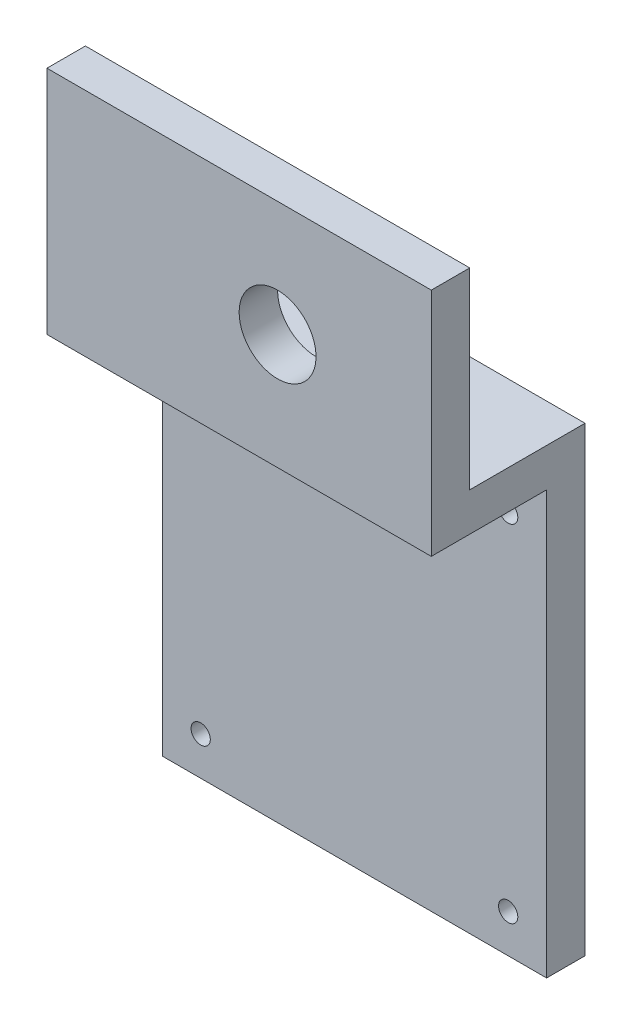
ISO-10303-21;
HEADER;
FILE_DESCRIPTION(('STEP AP214'),'2;1');
FILE_NAME('part.step','',(''),(''),'','','');
FILE_SCHEMA(('AUTOMOTIVE_DESIGN { 1 0 10303 214 1 1 1 1 }'));
ENDSEC;
DATA;
#1=APPLICATION_CONTEXT('core data for automotive mechanical design processes');
#2=APPLICATION_PROTOCOL_DEFINITION('international standard','automotive_design',2000,#1);
#3=PRODUCT_CONTEXT('',#1,'mechanical');
#4=PRODUCT('Part','Part','',(#3));
#5=PRODUCT_RELATED_PRODUCT_CATEGORY('part','',(#4));
#6=PRODUCT_DEFINITION_FORMATION('','',#4);
#7=PRODUCT_DEFINITION_CONTEXT('part definition',#1,'design');
#8=PRODUCT_DEFINITION('design','',#6,#7);
#9=PRODUCT_DEFINITION_SHAPE('','',#8);
#10=(LENGTH_UNIT() NAMED_UNIT(*) SI_UNIT(.MILLI.,.METRE.));
#11=(NAMED_UNIT(*) PLANE_ANGLE_UNIT() SI_UNIT($,.RADIAN.));
#12=(NAMED_UNIT(*) SI_UNIT($,.STERADIAN.) SOLID_ANGLE_UNIT());
#13=UNCERTAINTY_MEASURE_WITH_UNIT(LENGTH_MEASURE(1.E-05),#10,'distance_accuracy_value','');
#14=(GEOMETRIC_REPRESENTATION_CONTEXT(3) GLOBAL_UNCERTAINTY_ASSIGNED_CONTEXT((#13)) GLOBAL_UNIT_ASSIGNED_CONTEXT((#10,
#11,#12)) REPRESENTATION_CONTEXT('',''));
#15=CARTESIAN_POINT('',(0.,0.,0.));
#16=DIRECTION('',(0.,0.,1.));
#17=DIRECTION('',(1.,0.,0.));
#18=AXIS2_PLACEMENT_3D('',#15,#16,#17);
#19=CARTESIAN_POINT('',(-50.,60.,10.));
#20=DIRECTION('',(0.,-1.,0.));
#21=DIRECTION('',(0.,0.,-1.));
#22=AXIS2_PLACEMENT_3D('',#19,#20,#21);
#23=PLANE('',#22);
#24=DIRECTION('',(-1.,0.,0.));
#25=VECTOR('',#24,1.);
#26=CARTESIAN_POINT('',(-50.,60.,30.));
#27=LINE('',#26,#25);
#28=CARTESIAN_POINT('',(50.,60.,30.));
#29=VERTEX_POINT('',#28);
#30=CARTESIAN_POINT('',(-50.,60.,30.));
#31=VERTEX_POINT('',#30);
#32=EDGE_CURVE('E49',#29,#31,#27,.T.);
#33=ORIENTED_EDGE('',*,*,#32,.F.);
#34=DIRECTION('',(0.,0.,-1.));
#35=VECTOR('',#34,1.);
#36=CARTESIAN_POINT('',(50.,60.,10.));
#37=LINE('',#36,#35);
#38=CARTESIAN_POINT('',(50.,60.,0.));
#39=VERTEX_POINT('',#38);
#40=EDGE_CURVE('E11',#29,#39,#37,.T.);
#41=ORIENTED_EDGE('',*,*,#40,.T.);
#42=DIRECTION('',(-1.,0.,0.));
#43=VECTOR('',#42,1.);
#44=CARTESIAN_POINT('',(-50.,60.,0.));
#45=LINE('',#44,#43);
#46=CARTESIAN_POINT('',(-50.,60.,0.));
#47=VERTEX_POINT('',#46);
#48=EDGE_CURVE('E156',#39,#47,#45,.T.);
#49=ORIENTED_EDGE('',*,*,#48,.T.);
#50=DIRECTION('',(0.,0.,-1.));
#51=VECTOR('',#50,1.);
#52=CARTESIAN_POINT('',(-50.,60.,10.));
#53=LINE('',#52,#51);
#54=EDGE_CURVE('E43',#31,#47,#53,.T.);
#55=ORIENTED_EDGE('',*,*,#54,.F.);
#56=EDGE_LOOP('',(#33,#41,#49,#55));
#57=FACE_BOUND('',#56,.T.);
#58=ADVANCED_FACE('F34',(#57),#23,.F.);
#59=CARTESIAN_POINT('',(0.,0.,10.));
#60=DIRECTION('',(0.,0.,-1.));
#61=DIRECTION('',(-1.,0.,0.));
#62=AXIS2_PLACEMENT_3D('',#59,#60,#61);
#63=PLANE('',#62);
#64=CARTESIAN_POINT('',(40.,40.,10.));
#65=DIRECTION('',(0.,0.,-1.));
#66=DIRECTION('',(-1.,0.,0.));
#67=AXIS2_PLACEMENT_3D('',#64,#65,#66);
#68=CIRCLE('',#67,2.49999999999998);
#69=CARTESIAN_POINT('',(37.5,40.,10.));
#70=VERTEX_POINT('',#69);
#71=EDGE_CURVE('E246',#70,#70,#68,.T.);
#72=ORIENTED_EDGE('',*,*,#71,.T.);
#73=EDGE_LOOP('',(#72));
#74=FACE_BOUND('',#73,.T.);
#75=CARTESIAN_POINT('',(-40.,40.,10.));
#76=DIRECTION('',(0.,0.,-1.));
#77=DIRECTION('',(-1.,0.,0.));
#78=AXIS2_PLACEMENT_3D('',#75,#76,#77);
#79=CIRCLE('',#78,2.49999999999998);
#80=CARTESIAN_POINT('',(-42.5,40.,10.));
#81=VERTEX_POINT('',#80);
#82=EDGE_CURVE('E38',#81,#81,#79,.T.);
#83=ORIENTED_EDGE('',*,*,#82,.T.);
#84=EDGE_LOOP('',(#83));
#85=FACE_BOUND('',#84,.T.);
#86=CARTESIAN_POINT('',(-40.,-50.,10.));
#87=DIRECTION('',(0.,0.,-1.));
#88=DIRECTION('',(-1.,0.,0.));
#89=AXIS2_PLACEMENT_3D('',#86,#87,#88);
#90=CIRCLE('',#89,2.49999999999998);
#91=CARTESIAN_POINT('',(-42.5,-50.,10.));
#92=VERTEX_POINT('',#91);
#93=EDGE_CURVE('E239',#92,#92,#90,.T.);
#94=ORIENTED_EDGE('',*,*,#93,.T.);
#95=EDGE_LOOP('',(#94));
#96=FACE_BOUND('',#95,.T.);
#97=CARTESIAN_POINT('',(40.,-50.,10.));
#98=DIRECTION('',(0.,0.,-1.));
#99=DIRECTION('',(-1.,0.,0.));
#100=AXIS2_PLACEMENT_3D('',#97,#98,#99);
#101=CIRCLE('',#100,2.49999999999998);
#102=CARTESIAN_POINT('',(37.5,-50.,10.));
#103=VERTEX_POINT('',#102);
#104=EDGE_CURVE('E125',#103,#103,#101,.T.);
#105=ORIENTED_EDGE('',*,*,#104,.T.);
#106=EDGE_LOOP('',(#105));
#107=FACE_BOUND('',#106,.T.);
#108=DIRECTION('',(1.,0.,0.));
#109=VECTOR('',#108,1.);
#110=CARTESIAN_POINT('',(-50.,50.,10.));
#111=LINE('',#110,#109);
#112=CARTESIAN_POINT('',(-50.,50.,10.));
#113=VERTEX_POINT('',#112);
#114=CARTESIAN_POINT('',(50.,50.,10.));
#115=VERTEX_POINT('',#114);
#116=EDGE_CURVE('E57',#113,#115,#111,.T.);
#117=ORIENTED_EDGE('',*,*,#116,.F.);
#118=DIRECTION('',(0.,-1.,0.));
#119=VECTOR('',#118,1.);
#120=CARTESIAN_POINT('',(-50.,-60.,10.));
#121=LINE('',#120,#119);
#122=CARTESIAN_POINT('',(-50.,-60.,10.));
#123=VERTEX_POINT('',#122);
#124=EDGE_CURVE('E148',#113,#123,#121,.T.);
#125=ORIENTED_EDGE('',*,*,#124,.T.);
#126=DIRECTION('',(1.,0.,0.));
#127=VECTOR('',#126,1.);
#128=CARTESIAN_POINT('',(-50.,-60.,10.));
#129=LINE('',#128,#127);
#130=CARTESIAN_POINT('',(50.,-60.,10.));
#131=VERTEX_POINT('',#130);
#132=EDGE_CURVE('E151',#123,#131,#129,.T.);
#133=ORIENTED_EDGE('',*,*,#132,.T.);
#134=DIRECTION('',(0.,1.,0.));
#135=VECTOR('',#134,1.);
#136=CARTESIAN_POINT('',(50.,-60.,10.));
#137=LINE('',#136,#135);
#138=EDGE_CURVE('E146',#131,#115,#137,.T.);
#139=ORIENTED_EDGE('',*,*,#138,.T.);
#140=EDGE_LOOP('',(#117,#125,#133,#139));
#141=FACE_BOUND('',#140,.T.);
#142=ADVANCED_FACE('F180',(#74,#85,#96,#107,#141),#63,.F.);
#143=CARTESIAN_POINT('',(50.,-60.,10.));
#144=DIRECTION('',(-1.,0.,0.));
#145=DIRECTION('',(0.,0.,1.));
#146=AXIS2_PLACEMENT_3D('',#143,#144,#145);
#147=PLANE('',#146);
#148=DIRECTION('',(0.,1.,0.));
#149=VECTOR('',#148,1.);
#150=CARTESIAN_POINT('',(50.,-60.,0.));
#151=LINE('',#150,#149);
#152=CARTESIAN_POINT('',(50.,-60.,0.));
#153=VERTEX_POINT('',#152);
#154=EDGE_CURVE('E145',#153,#39,#151,.T.);
#155=ORIENTED_EDGE('',*,*,#154,.T.);
#156=ORIENTED_EDGE('',*,*,#40,.F.);
#157=DIRECTION('',(0.,-1.,0.));
#158=VECTOR('',#157,1.);
#159=CARTESIAN_POINT('',(50.,110.,30.));
#160=LINE('',#159,#158);
#161=CARTESIAN_POINT('',(50.,110.,30.));
#162=VERTEX_POINT('',#161);
#163=EDGE_CURVE('E134',#162,#29,#160,.T.);
#164=ORIENTED_EDGE('',*,*,#163,.F.);
#165=DIRECTION('',(0.,0.,-1.));
#166=VECTOR('',#165,1.);
#167=CARTESIAN_POINT('',(50.,110.,30.));
#168=LINE('',#167,#166);
#169=CARTESIAN_POINT('',(50.,110.,40.));
#170=VERTEX_POINT('',#169);
#171=EDGE_CURVE('E118',#170,#162,#168,.T.);
#172=ORIENTED_EDGE('',*,*,#171,.F.);
#173=DIRECTION('',(0.,1.,0.));
#174=VECTOR('',#173,1.);
#175=CARTESIAN_POINT('',(50.,50.,40.));
#176=LINE('',#175,#174);
#177=CARTESIAN_POINT('',(50.,50.,40.));
#178=VERTEX_POINT('',#177);
#179=EDGE_CURVE('E110',#178,#170,#176,.T.);
#180=ORIENTED_EDGE('',*,*,#179,.F.);
#181=DIRECTION('',(0.,0.,-1.));
#182=VECTOR('',#181,1.);
#183=CARTESIAN_POINT('',(50.,50.,30.));
#184=LINE('',#183,#182);
#185=EDGE_CURVE('E141',#178,#115,#184,.T.);
#186=ORIENTED_EDGE('',*,*,#185,.T.);
#187=ORIENTED_EDGE('',*,*,#138,.F.);
#188=DIRECTION('',(0.,0.,-1.));
#189=VECTOR('',#188,1.);
#190=CARTESIAN_POINT('',(50.,-60.,10.));
#191=LINE('',#190,#189);
#192=EDGE_CURVE('E153',#131,#153,#191,.T.);
#193=ORIENTED_EDGE('',*,*,#192,.T.);
#194=EDGE_LOOP('',(#155,#156,#164,#172,#180,#186,#187,#193));
#195=FACE_BOUND('',#194,.T.);
#196=ADVANCED_FACE('F36',(#195),#147,.F.);
#197=CARTESIAN_POINT('',(-50.,-60.,10.));
#198=DIRECTION('',(1.,0.,0.));
#199=DIRECTION('',(0.,0.,-1.));
#200=AXIS2_PLACEMENT_3D('',#197,#198,#199);
#201=PLANE('',#200);
#202=DIRECTION('',(0.,-1.,0.));
#203=VECTOR('',#202,1.);
#204=CARTESIAN_POINT('',(-50.,-60.,0.));
#205=LINE('',#204,#203);
#206=CARTESIAN_POINT('',(-50.,-60.,0.));
#207=VERTEX_POINT('',#206);
#208=EDGE_CURVE('E159',#47,#207,#205,.T.);
#209=ORIENTED_EDGE('',*,*,#208,.T.);
#210=DIRECTION('',(0.,0.,-1.));
#211=VECTOR('',#210,1.);
#212=CARTESIAN_POINT('',(-50.,-60.,10.));
#213=LINE('',#212,#211);
#214=EDGE_CURVE('E164',#123,#207,#213,.T.);
#215=ORIENTED_EDGE('',*,*,#214,.F.);
#216=ORIENTED_EDGE('',*,*,#124,.F.);
#217=DIRECTION('',(0.,0.,-1.));
#218=VECTOR('',#217,1.);
#219=CARTESIAN_POINT('',(-50.,50.,30.));
#220=LINE('',#219,#218);
#221=CARTESIAN_POINT('',(-50.,50.,40.));
#222=VERTEX_POINT('',#221);
#223=EDGE_CURVE('E106',#222,#113,#220,.T.);
#224=ORIENTED_EDGE('',*,*,#223,.F.);
#225=DIRECTION('',(0.,1.,0.));
#226=VECTOR('',#225,1.);
#227=CARTESIAN_POINT('',(-50.,50.,40.));
#228=LINE('',#227,#226);
#229=CARTESIAN_POINT('',(-50.,110.,40.));
#230=VERTEX_POINT('',#229);
#231=EDGE_CURVE('E99',#222,#230,#228,.T.);
#232=ORIENTED_EDGE('',*,*,#231,.T.);
#233=DIRECTION('',(0.,0.,1.));
#234=VECTOR('',#233,1.);
#235=CARTESIAN_POINT('',(-50.,110.,30.));
#236=LINE('',#235,#234);
#237=CARTESIAN_POINT('',(-50.,110.,30.));
#238=VERTEX_POINT('',#237);
#239=EDGE_CURVE('E104',#238,#230,#236,.T.);
#240=ORIENTED_EDGE('',*,*,#239,.F.);
#241=DIRECTION('',(0.,-1.,0.));
#242=VECTOR('',#241,1.);
#243=CARTESIAN_POINT('',(-50.,110.,30.));
#244=LINE('',#243,#242);
#245=EDGE_CURVE('E131',#238,#31,#244,.T.);
#246=ORIENTED_EDGE('',*,*,#245,.T.);
#247=ORIENTED_EDGE('',*,*,#54,.T.);
#248=EDGE_LOOP('',(#209,#215,#216,#224,#232,#240,#246,#247));
#249=FACE_BOUND('',#248,.T.);
#250=ADVANCED_FACE('F101',(#249),#201,.F.);
#251=CARTESIAN_POINT('',(-50.,-60.,10.));
#252=DIRECTION('',(0.,1.,0.));
#253=DIRECTION('',(0.,0.,1.));
#254=AXIS2_PLACEMENT_3D('',#251,#252,#253);
#255=PLANE('',#254);
#256=DIRECTION('',(1.,0.,0.));
#257=VECTOR('',#256,1.);
#258=CARTESIAN_POINT('',(-50.,-60.,0.));
#259=LINE('',#258,#257);
#260=EDGE_CURVE('E149',#207,#153,#259,.T.);
#261=ORIENTED_EDGE('',*,*,#260,.T.);
#262=ORIENTED_EDGE('',*,*,#192,.F.);
#263=ORIENTED_EDGE('',*,*,#132,.F.);
#264=ORIENTED_EDGE('',*,*,#214,.T.);
#265=EDGE_LOOP('',(#261,#262,#263,#264));
#266=FACE_BOUND('',#265,.T.);
#267=ADVANCED_FACE('F176',(#266),#255,.F.);
#268=CARTESIAN_POINT('',(0.,0.,0.));
#269=DIRECTION('',(0.,0.,-1.));
#270=DIRECTION('',(-1.,0.,0.));
#271=AXIS2_PLACEMENT_3D('',#268,#269,#270);
#272=PLANE('',#271);
#273=CARTESIAN_POINT('',(40.,40.,0.));
#274=DIRECTION('',(0.,0.,-1.));
#275=DIRECTION('',(-1.,0.,0.));
#276=AXIS2_PLACEMENT_3D('',#273,#274,#275);
#277=CIRCLE('',#276,2.49999999999999);
#278=CARTESIAN_POINT('',(37.5,40.,0.));
#279=VERTEX_POINT('',#278);
#280=EDGE_CURVE('E226',#279,#279,#277,.T.);
#281=ORIENTED_EDGE('',*,*,#280,.F.);
#282=EDGE_LOOP('',(#281));
#283=FACE_BOUND('',#282,.T.);
#284=CARTESIAN_POINT('',(-40.,40.,0.));
#285=DIRECTION('',(0.,0.,-1.));
#286=DIRECTION('',(-1.,0.,0.));
#287=AXIS2_PLACEMENT_3D('',#284,#285,#286);
#288=CIRCLE('',#287,2.49999999999999);
#289=CARTESIAN_POINT('',(-42.5,40.,0.));
#290=VERTEX_POINT('',#289);
#291=EDGE_CURVE('E230',#290,#290,#288,.T.);
#292=ORIENTED_EDGE('',*,*,#291,.F.);
#293=EDGE_LOOP('',(#292));
#294=FACE_BOUND('',#293,.T.);
#295=CARTESIAN_POINT('',(-40.,-50.,0.));
#296=DIRECTION('',(0.,0.,-1.));
#297=DIRECTION('',(-1.,0.,0.));
#298=AXIS2_PLACEMENT_3D('',#295,#296,#297);
#299=CIRCLE('',#298,2.49999999999999);
#300=CARTESIAN_POINT('',(-42.5,-50.,0.));
#301=VERTEX_POINT('',#300);
#302=EDGE_CURVE('E234',#301,#301,#299,.T.);
#303=ORIENTED_EDGE('',*,*,#302,.F.);
#304=EDGE_LOOP('',(#303));
#305=FACE_BOUND('',#304,.T.);
#306=CARTESIAN_POINT('',(40.,-50.,0.));
#307=DIRECTION('',(0.,0.,-1.));
#308=DIRECTION('',(-1.,0.,0.));
#309=AXIS2_PLACEMENT_3D('',#306,#307,#308);
#310=CIRCLE('',#309,2.49999999999999);
#311=CARTESIAN_POINT('',(37.5,-50.,0.));
#312=VERTEX_POINT('',#311);
#313=EDGE_CURVE('E237',#312,#312,#310,.T.);
#314=ORIENTED_EDGE('',*,*,#313,.F.);
#315=EDGE_LOOP('',(#314));
#316=FACE_BOUND('',#315,.T.);
#317=ORIENTED_EDGE('',*,*,#154,.F.);
#318=ORIENTED_EDGE('',*,*,#260,.F.);
#319=ORIENTED_EDGE('',*,*,#208,.F.);
#320=ORIENTED_EDGE('',*,*,#48,.F.);
#321=EDGE_LOOP('',(#317,#318,#319,#320));
#322=FACE_BOUND('',#321,.T.);
#323=ADVANCED_FACE('F173',(#283,#294,#305,#316,#322),#272,.T.);
#324=CARTESIAN_POINT('',(-50.,50.,30.));
#325=DIRECTION('',(0.,1.,0.));
#326=DIRECTION('',(-1.,0.,0.));
#327=AXIS2_PLACEMENT_3D('',#324,#325,#326);
#328=PLANE('',#327);
#329=ORIENTED_EDGE('',*,*,#116,.T.);
#330=ORIENTED_EDGE('',*,*,#185,.F.);
#331=DIRECTION('',(-1.,0.,0.));
#332=VECTOR('',#331,1.);
#333=CARTESIAN_POINT('',(50.,50.,40.));
#334=LINE('',#333,#332);
#335=EDGE_CURVE('E137',#178,#222,#334,.T.);
#336=ORIENTED_EDGE('',*,*,#335,.T.);
#337=ORIENTED_EDGE('',*,*,#223,.T.);
#338=EDGE_LOOP('',(#329,#330,#336,#337));
#339=FACE_BOUND('',#338,.T.);
#340=ADVANCED_FACE('F182',(#339),#328,.F.);
#341=CARTESIAN_POINT('',(-50.,110.,30.));
#342=DIRECTION('',(0.,0.,1.));
#343=DIRECTION('',(1.,0.,0.));
#344=AXIS2_PLACEMENT_3D('',#341,#342,#343);
#345=PLANE('',#344);
#346=CARTESIAN_POINT('',(10.,80.,30.));
#347=DIRECTION('',(0.,0.,-1.));
#348=DIRECTION('',(-1.,0.,0.));
#349=AXIS2_PLACEMENT_3D('',#346,#347,#348);
#350=CIRCLE('',#349,9.99999999999999);
#351=CARTESIAN_POINT('',(0.,80.,30.));
#352=VERTEX_POINT('',#351);
#353=EDGE_CURVE('E252',#352,#352,#350,.T.);
#354=ORIENTED_EDGE('',*,*,#353,.F.);
#355=EDGE_LOOP('',(#354));
#356=FACE_BOUND('',#355,.T.);
#357=ORIENTED_EDGE('',*,*,#32,.T.);
#358=ORIENTED_EDGE('',*,*,#245,.F.);
#359=DIRECTION('',(-1.,0.,0.));
#360=VECTOR('',#359,1.);
#361=CARTESIAN_POINT('',(-50.,110.,30.));
#362=LINE('',#361,#360);
#363=EDGE_CURVE('E122',#162,#238,#362,.T.);
#364=ORIENTED_EDGE('',*,*,#363,.F.);
#365=ORIENTED_EDGE('',*,*,#163,.T.);
#366=EDGE_LOOP('',(#357,#358,#364,#365));
#367=FACE_BOUND('',#366,.T.);
#368=ADVANCED_FACE('F185',(#356,#367),#345,.F.);
#369=CARTESIAN_POINT('',(0.,110.,0.));
#370=DIRECTION('',(0.,1.,0.));
#371=DIRECTION('',(0.,0.,1.));
#372=AXIS2_PLACEMENT_3D('',#369,#370,#371);
#373=PLANE('',#372);
#374=ORIENTED_EDGE('',*,*,#239,.T.);
#375=DIRECTION('',(1.,0.,0.));
#376=VECTOR('',#375,1.);
#377=CARTESIAN_POINT('',(-50.,110.,40.));
#378=LINE('',#377,#376);
#379=EDGE_CURVE('E113',#230,#170,#378,.T.);
#380=ORIENTED_EDGE('',*,*,#379,.T.);
#381=ORIENTED_EDGE('',*,*,#171,.T.);
#382=ORIENTED_EDGE('',*,*,#363,.T.);
#383=EDGE_LOOP('',(#374,#380,#381,#382));
#384=FACE_BOUND('',#383,.T.);
#385=ADVANCED_FACE('F120',(#384),#373,.T.);
#386=CARTESIAN_POINT('',(40.,-50.,0.));
#387=DIRECTION('',(0.,0.,-1.));
#388=DIRECTION('',(-1.,0.,0.));
#389=AXIS2_PLACEMENT_3D('',#386,#387,#388);
#390=CYLINDRICAL_SURFACE('',#389,2.49999999999998);
#391=ORIENTED_EDGE('',*,*,#313,.T.);
#392=EDGE_LOOP('',(#391));
#393=FACE_BOUND('',#392,.T.);
#394=ORIENTED_EDGE('',*,*,#104,.F.);
#395=EDGE_LOOP('',(#394));
#396=FACE_BOUND('',#395,.T.);
#397=ADVANCED_FACE('F193',(#393,#396),#390,.F.);
#398=CARTESIAN_POINT('',(-40.,-50.,0.));
#399=DIRECTION('',(0.,0.,-1.));
#400=DIRECTION('',(-1.,0.,0.));
#401=AXIS2_PLACEMENT_3D('',#398,#399,#400);
#402=CYLINDRICAL_SURFACE('',#401,2.49999999999998);
#403=ORIENTED_EDGE('',*,*,#302,.T.);
#404=EDGE_LOOP('',(#403));
#405=FACE_BOUND('',#404,.T.);
#406=ORIENTED_EDGE('',*,*,#93,.F.);
#407=EDGE_LOOP('',(#406));
#408=FACE_BOUND('',#407,.T.);
#409=ADVANCED_FACE('F271',(#405,#408),#402,.F.);
#410=CARTESIAN_POINT('',(-40.,40.,0.));
#411=DIRECTION('',(0.,0.,-1.));
#412=DIRECTION('',(-1.,0.,0.));
#413=AXIS2_PLACEMENT_3D('',#410,#411,#412);
#414=CYLINDRICAL_SURFACE('',#413,2.49999999999998);
#415=ORIENTED_EDGE('',*,*,#291,.T.);
#416=EDGE_LOOP('',(#415));
#417=FACE_BOUND('',#416,.T.);
#418=ORIENTED_EDGE('',*,*,#82,.F.);
#419=EDGE_LOOP('',(#418));
#420=FACE_BOUND('',#419,.T.);
#421=ADVANCED_FACE('F259',(#417,#420),#414,.F.);
#422=CARTESIAN_POINT('',(40.,40.,0.));
#423=DIRECTION('',(0.,0.,-1.));
#424=DIRECTION('',(-1.,0.,0.));
#425=AXIS2_PLACEMENT_3D('',#422,#423,#424);
#426=CYLINDRICAL_SURFACE('',#425,2.49999999999998);
#427=ORIENTED_EDGE('',*,*,#280,.T.);
#428=EDGE_LOOP('',(#427));
#429=FACE_BOUND('',#428,.T.);
#430=ORIENTED_EDGE('',*,*,#71,.F.);
#431=EDGE_LOOP('',(#430));
#432=FACE_BOUND('',#431,.T.);
#433=ADVANCED_FACE('F204',(#429,#432),#426,.F.);
#434=CARTESIAN_POINT('',(10.,80.,30.));
#435=DIRECTION('',(0.,0.,-1.));
#436=DIRECTION('',(-1.,0.,0.));
#437=AXIS2_PLACEMENT_3D('',#434,#435,#436);
#438=CYLINDRICAL_SURFACE('',#437,9.99999999999998);
#439=ORIENTED_EDGE('',*,*,#353,.T.);
#440=EDGE_LOOP('',(#439));
#441=FACE_BOUND('',#440,.T.);
#442=CARTESIAN_POINT('',(10.,80.,40.));
#443=DIRECTION('',(0.,0.,-1.));
#444=DIRECTION('',(-1.,0.,0.));
#445=AXIS2_PLACEMENT_3D('',#442,#443,#444);
#446=CIRCLE('',#445,9.99999999999998);
#447=CARTESIAN_POINT('',(0.,80.,40.));
#448=VERTEX_POINT('',#447);
#449=EDGE_CURVE('E250',#448,#448,#446,.T.);
#450=ORIENTED_EDGE('',*,*,#449,.F.);
#451=EDGE_LOOP('',(#450));
#452=FACE_BOUND('',#451,.T.);
#453=ADVANCED_FACE('F199',(#441,#452),#438,.F.);
#454=CARTESIAN_POINT('',(50.,50.,40.));
#455=DIRECTION('',(0.,0.,-1.));
#456=DIRECTION('',(-1.,0.,0.));
#457=AXIS2_PLACEMENT_3D('',#454,#455,#456);
#458=PLANE('',#457);
#459=ORIENTED_EDGE('',*,*,#449,.T.);
#460=EDGE_LOOP('',(#459));
#461=FACE_BOUND('',#460,.T.);
#462=ORIENTED_EDGE('',*,*,#179,.T.);
#463=ORIENTED_EDGE('',*,*,#379,.F.);
#464=ORIENTED_EDGE('',*,*,#231,.F.);
#465=ORIENTED_EDGE('',*,*,#335,.F.);
#466=EDGE_LOOP('',(#462,#463,#464,#465));
#467=FACE_BOUND('',#466,.T.);
#468=ADVANCED_FACE('F114',(#461,#467),#458,.F.);
#469=CLOSED_SHELL('',(#58,#142,#196,#250,#267,#323,#340,#368,#385,#397,#409,#421,#433,#453,#468));
#470=MANIFOLD_SOLID_BREP('B2',#469);
#471=ADVANCED_BREP_SHAPE_REPRESENTATION('',(#18,#470),#14);
#472=SHAPE_DEFINITION_REPRESENTATION(#9,#471);
ENDSEC;
END-ISO-10303-21;
